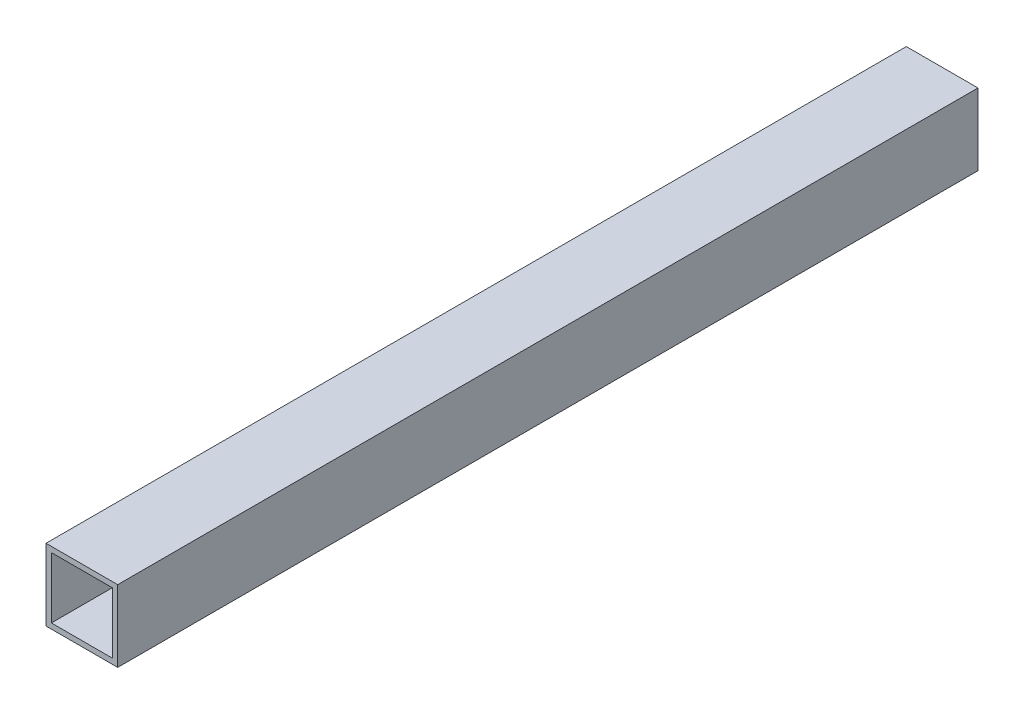
ISO-10303-21;
HEADER;
FILE_DESCRIPTION(('STEP AP214'),'2;1');
FILE_NAME('part.step','',(''),(''),'','','');
FILE_SCHEMA(('AUTOMOTIVE_DESIGN { 1 0 10303 214 1 1 1 1 }'));
ENDSEC;
DATA;
#1=APPLICATION_CONTEXT('core data for automotive mechanical design processes');
#2=APPLICATION_PROTOCOL_DEFINITION('international standard','automotive_design',2000,#1);
#3=PRODUCT_CONTEXT('',#1,'mechanical');
#4=PRODUCT('Part','Part','',(#3));
#5=PRODUCT_RELATED_PRODUCT_CATEGORY('part','',(#4));
#6=PRODUCT_DEFINITION_FORMATION('','',#4);
#7=PRODUCT_DEFINITION_CONTEXT('part definition',#1,'design');
#8=PRODUCT_DEFINITION('design','',#6,#7);
#9=PRODUCT_DEFINITION_SHAPE('','',#8);
#10=(LENGTH_UNIT() NAMED_UNIT(*) SI_UNIT(.MILLI.,.METRE.));
#11=(NAMED_UNIT(*) PLANE_ANGLE_UNIT() SI_UNIT($,.RADIAN.));
#12=(NAMED_UNIT(*) SI_UNIT($,.STERADIAN.) SOLID_ANGLE_UNIT());
#13=UNCERTAINTY_MEASURE_WITH_UNIT(LENGTH_MEASURE(1.E-05),#10,'distance_accuracy_value','');
#14=(GEOMETRIC_REPRESENTATION_CONTEXT(3) GLOBAL_UNCERTAINTY_ASSIGNED_CONTEXT((#13)) GLOBAL_UNIT_ASSIGNED_CONTEXT((#10,
#11,#12)) REPRESENTATION_CONTEXT('',''));
#15=CARTESIAN_POINT('',(0.,0.,0.));
#16=DIRECTION('',(0.,0.,1.));
#17=DIRECTION('',(1.,0.,0.));
#18=AXIS2_PLACEMENT_3D('',#15,#16,#17);
#19=CARTESIAN_POINT('',(0.,0.,240.));
#20=DIRECTION('',(0.,0.,1.));
#21=DIRECTION('',(1.,0.,0.));
#22=AXIS2_PLACEMENT_3D('',#19,#20,#21);
#23=PLANE('',#22);
#24=DIRECTION('',(0.,-1.,0.));
#25=VECTOR('',#24,1.);
#26=CARTESIAN_POINT('',(-10.,-10.,240.));
#27=LINE('',#26,#25);
#28=CARTESIAN_POINT('',(-10.,10.,240.));
#29=VERTEX_POINT('',#28);
#30=CARTESIAN_POINT('',(-10.,-10.,240.));
#31=VERTEX_POINT('',#30);
#32=EDGE_CURVE('E134',#29,#31,#27,.T.);
#33=ORIENTED_EDGE('',*,*,#32,.T.);
#34=DIRECTION('',(1.,0.,0.));
#35=VECTOR('',#34,1.);
#36=CARTESIAN_POINT('',(10.,-10.,240.));
#37=LINE('',#36,#35);
#38=CARTESIAN_POINT('',(10.,-10.,240.));
#39=VERTEX_POINT('',#38);
#40=EDGE_CURVE('E137',#31,#39,#37,.T.);
#41=ORIENTED_EDGE('',*,*,#40,.T.);
#42=DIRECTION('',(0.,1.,0.));
#43=VECTOR('',#42,1.);
#44=CARTESIAN_POINT('',(10.,-10.,240.));
#45=LINE('',#44,#43);
#46=CARTESIAN_POINT('',(10.,10.,240.));
#47=VERTEX_POINT('',#46);
#48=EDGE_CURVE('E140',#39,#47,#45,.T.);
#49=ORIENTED_EDGE('',*,*,#48,.T.);
#50=DIRECTION('',(-1.,0.,0.));
#51=VECTOR('',#50,1.);
#52=CARTESIAN_POINT('',(10.,10.,240.));
#53=LINE('',#52,#51);
#54=EDGE_CURVE('E142',#47,#29,#53,.T.);
#55=ORIENTED_EDGE('',*,*,#54,.T.);
#56=EDGE_LOOP('',(#33,#41,#49,#55));
#57=FACE_BOUND('',#56,.T.);
#58=DIRECTION('',(-1.,0.,0.));
#59=VECTOR('',#58,1.);
#60=CARTESIAN_POINT('',(8.5,8.5,240.));
#61=LINE('',#60,#59);
#62=CARTESIAN_POINT('',(8.5,8.5,240.));
#63=VERTEX_POINT('',#62);
#64=CARTESIAN_POINT('',(-8.5,8.49999999999999,240.));
#65=VERTEX_POINT('',#64);
#66=EDGE_CURVE('E106',#63,#65,#61,.T.);
#67=ORIENTED_EDGE('',*,*,#66,.F.);
#68=DIRECTION('',(0.,1.,0.));
#69=VECTOR('',#68,1.);
#70=CARTESIAN_POINT('',(8.5,-8.5,240.));
#71=LINE('',#70,#69);
#72=CARTESIAN_POINT('',(8.5,-8.5,240.));
#73=VERTEX_POINT('',#72);
#74=EDGE_CURVE('E98',#73,#63,#71,.T.);
#75=ORIENTED_EDGE('',*,*,#74,.F.);
#76=DIRECTION('',(1.,0.,0.));
#77=VECTOR('',#76,1.);
#78=CARTESIAN_POINT('',(8.5,-8.5,240.));
#79=LINE('',#78,#77);
#80=CARTESIAN_POINT('',(-8.5,-8.5,240.));
#81=VERTEX_POINT('',#80);
#82=EDGE_CURVE('E120',#81,#73,#79,.T.);
#83=ORIENTED_EDGE('',*,*,#82,.F.);
#84=DIRECTION('',(0.,-1.,0.));
#85=VECTOR('',#84,1.);
#86=CARTESIAN_POINT('',(-8.5,-8.5,240.));
#87=LINE('',#86,#85);
#88=EDGE_CURVE('E118',#65,#81,#87,.T.);
#89=ORIENTED_EDGE('',*,*,#88,.F.);
#90=EDGE_LOOP('',(#67,#75,#83,#89));
#91=FACE_BOUND('',#90,.T.);
#92=ADVANCED_FACE('F33',(#57,#91),#23,.T.);
#93=CARTESIAN_POINT('',(0.,0.,0.));
#94=DIRECTION('',(0.,0.,1.));
#95=DIRECTION('',(1.,0.,0.));
#96=AXIS2_PLACEMENT_3D('',#93,#94,#95);
#97=PLANE('',#96);
#98=DIRECTION('',(0.,-1.,0.));
#99=VECTOR('',#98,1.);
#100=CARTESIAN_POINT('',(-10.,-10.,0.));
#101=LINE('',#100,#99);
#102=CARTESIAN_POINT('',(-10.,10.,0.));
#103=VERTEX_POINT('',#102);
#104=CARTESIAN_POINT('',(-10.,-10.,0.));
#105=VERTEX_POINT('',#104);
#106=EDGE_CURVE('E114',#103,#105,#101,.T.);
#107=ORIENTED_EDGE('',*,*,#106,.F.);
#108=DIRECTION('',(-1.,0.,0.));
#109=VECTOR('',#108,1.);
#110=CARTESIAN_POINT('',(10.,10.,0.));
#111=LINE('',#110,#109);
#112=CARTESIAN_POINT('',(10.,10.,0.));
#113=VERTEX_POINT('',#112);
#114=EDGE_CURVE('E138',#113,#103,#111,.T.);
#115=ORIENTED_EDGE('',*,*,#114,.F.);
#116=DIRECTION('',(0.,1.,0.));
#117=VECTOR('',#116,1.);
#118=CARTESIAN_POINT('',(10.,-10.,0.));
#119=LINE('',#118,#117);
#120=CARTESIAN_POINT('',(10.,-10.,0.));
#121=VERTEX_POINT('',#120);
#122=EDGE_CURVE('E149',#121,#113,#119,.T.);
#123=ORIENTED_EDGE('',*,*,#122,.F.);
#124=DIRECTION('',(1.,0.,0.));
#125=VECTOR('',#124,1.);
#126=CARTESIAN_POINT('',(10.,-10.,0.));
#127=LINE('',#126,#125);
#128=EDGE_CURVE('E147',#105,#121,#127,.T.);
#129=ORIENTED_EDGE('',*,*,#128,.F.);
#130=EDGE_LOOP('',(#107,#115,#123,#129));
#131=FACE_BOUND('',#130,.T.);
#132=DIRECTION('',(0.,1.,0.));
#133=VECTOR('',#132,1.);
#134=CARTESIAN_POINT('',(8.5,-8.5,0.));
#135=LINE('',#134,#133);
#136=CARTESIAN_POINT('',(8.5,-8.5,0.));
#137=VERTEX_POINT('',#136);
#138=CARTESIAN_POINT('',(8.5,8.5,0.));
#139=VERTEX_POINT('',#138);
#140=EDGE_CURVE('E56',#137,#139,#135,.T.);
#141=ORIENTED_EDGE('',*,*,#140,.T.);
#142=DIRECTION('',(-1.,0.,0.));
#143=VECTOR('',#142,1.);
#144=CARTESIAN_POINT('',(8.5,8.5,0.));
#145=LINE('',#144,#143);
#146=CARTESIAN_POINT('',(-8.5,8.49999999999999,0.));
#147=VERTEX_POINT('',#146);
#148=EDGE_CURVE('E113',#139,#147,#145,.T.);
#149=ORIENTED_EDGE('',*,*,#148,.T.);
#150=DIRECTION('',(0.,-1.,0.));
#151=VECTOR('',#150,1.);
#152=CARTESIAN_POINT('',(-8.5,-8.5,0.));
#153=LINE('',#152,#151);
#154=CARTESIAN_POINT('',(-8.5,-8.5,0.));
#155=VERTEX_POINT('',#154);
#156=EDGE_CURVE('E126',#147,#155,#153,.T.);
#157=ORIENTED_EDGE('',*,*,#156,.T.);
#158=DIRECTION('',(1.,0.,0.));
#159=VECTOR('',#158,1.);
#160=CARTESIAN_POINT('',(8.5,-8.5,0.));
#161=LINE('',#160,#159);
#162=EDGE_CURVE('E107',#155,#137,#161,.T.);
#163=ORIENTED_EDGE('',*,*,#162,.T.);
#164=EDGE_LOOP('',(#141,#149,#157,#163));
#165=FACE_BOUND('',#164,.T.);
#166=ADVANCED_FACE('F167',(#131,#165),#97,.F.);
#167=CARTESIAN_POINT('',(-10.,-10.,240.));
#168=DIRECTION('',(1.,0.,0.));
#169=DIRECTION('',(0.,0.,-1.));
#170=AXIS2_PLACEMENT_3D('',#167,#168,#169);
#171=PLANE('',#170);
#172=ORIENTED_EDGE('',*,*,#106,.T.);
#173=DIRECTION('',(0.,0.,-1.));
#174=VECTOR('',#173,1.);
#175=CARTESIAN_POINT('',(-10.,-10.,240.));
#176=LINE('',#175,#174);
#177=EDGE_CURVE('E11',#31,#105,#176,.T.);
#178=ORIENTED_EDGE('',*,*,#177,.F.);
#179=ORIENTED_EDGE('',*,*,#32,.F.);
#180=DIRECTION('',(0.,0.,-1.));
#181=VECTOR('',#180,1.);
#182=CARTESIAN_POINT('',(-10.,10.,240.));
#183=LINE('',#182,#181);
#184=EDGE_CURVE('E144',#29,#103,#183,.T.);
#185=ORIENTED_EDGE('',*,*,#184,.T.);
#186=EDGE_LOOP('',(#172,#178,#179,#185));
#187=FACE_BOUND('',#186,.T.);
#188=ADVANCED_FACE('F35',(#187),#171,.F.);
#189=CARTESIAN_POINT('',(10.,-10.,240.));
#190=DIRECTION('',(0.,1.,0.));
#191=DIRECTION('',(-1.,0.,0.));
#192=AXIS2_PLACEMENT_3D('',#189,#190,#191);
#193=PLANE('',#192);
#194=ORIENTED_EDGE('',*,*,#128,.T.);
#195=DIRECTION('',(0.,0.,-1.));
#196=VECTOR('',#195,1.);
#197=CARTESIAN_POINT('',(10.,-10.,240.));
#198=LINE('',#197,#196);
#199=EDGE_CURVE('E41',#39,#121,#198,.T.);
#200=ORIENTED_EDGE('',*,*,#199,.F.);
#201=ORIENTED_EDGE('',*,*,#40,.F.);
#202=ORIENTED_EDGE('',*,*,#177,.T.);
#203=EDGE_LOOP('',(#194,#200,#201,#202));
#204=FACE_BOUND('',#203,.T.);
#205=ADVANCED_FACE('F177',(#204),#193,.F.);
#206=CARTESIAN_POINT('',(10.,-10.,240.));
#207=DIRECTION('',(-1.,0.,0.));
#208=DIRECTION('',(0.,0.,1.));
#209=AXIS2_PLACEMENT_3D('',#206,#207,#208);
#210=PLANE('',#209);
#211=ORIENTED_EDGE('',*,*,#122,.T.);
#212=DIRECTION('',(0.,0.,-1.));
#213=VECTOR('',#212,1.);
#214=CARTESIAN_POINT('',(10.,10.,240.));
#215=LINE('',#214,#213);
#216=EDGE_CURVE('E154',#47,#113,#215,.T.);
#217=ORIENTED_EDGE('',*,*,#216,.F.);
#218=ORIENTED_EDGE('',*,*,#48,.F.);
#219=ORIENTED_EDGE('',*,*,#199,.T.);
#220=EDGE_LOOP('',(#211,#217,#218,#219));
#221=FACE_BOUND('',#220,.T.);
#222=ADVANCED_FACE('F161',(#221),#210,.F.);
#223=CARTESIAN_POINT('',(10.,10.,240.));
#224=DIRECTION('',(0.,-1.,0.));
#225=DIRECTION('',(1.,0.,0.));
#226=AXIS2_PLACEMENT_3D('',#223,#224,#225);
#227=PLANE('',#226);
#228=ORIENTED_EDGE('',*,*,#114,.T.);
#229=ORIENTED_EDGE('',*,*,#184,.F.);
#230=ORIENTED_EDGE('',*,*,#54,.F.);
#231=ORIENTED_EDGE('',*,*,#216,.T.);
#232=EDGE_LOOP('',(#228,#229,#230,#231));
#233=FACE_BOUND('',#232,.T.);
#234=ADVANCED_FACE('F171',(#233),#227,.F.);
#235=CARTESIAN_POINT('',(8.5,-8.5,240.));
#236=DIRECTION('',(-1.,0.,0.));
#237=DIRECTION('',(0.,0.,1.));
#238=AXIS2_PLACEMENT_3D('',#235,#236,#237);
#239=PLANE('',#238);
#240=ORIENTED_EDGE('',*,*,#140,.F.);
#241=DIRECTION('',(0.,0.,-1.));
#242=VECTOR('',#241,1.);
#243=CARTESIAN_POINT('',(8.5,-8.5,240.));
#244=LINE('',#243,#242);
#245=EDGE_CURVE('E102',#73,#137,#244,.T.);
#246=ORIENTED_EDGE('',*,*,#245,.F.);
#247=ORIENTED_EDGE('',*,*,#74,.T.);
#248=DIRECTION('',(0.,0.,-1.));
#249=VECTOR('',#248,1.);
#250=CARTESIAN_POINT('',(8.5,8.5,240.));
#251=LINE('',#250,#249);
#252=EDGE_CURVE('E101',#63,#139,#251,.T.);
#253=ORIENTED_EDGE('',*,*,#252,.T.);
#254=EDGE_LOOP('',(#240,#246,#247,#253));
#255=FACE_BOUND('',#254,.T.);
#256=ADVANCED_FACE('F100',(#255),#239,.T.);
#257=CARTESIAN_POINT('',(8.5,8.5,240.));
#258=DIRECTION('',(0.,-1.,0.));
#259=DIRECTION('',(1.,0.,0.));
#260=AXIS2_PLACEMENT_3D('',#257,#258,#259);
#261=PLANE('',#260);
#262=ORIENTED_EDGE('',*,*,#148,.F.);
#263=ORIENTED_EDGE('',*,*,#252,.F.);
#264=ORIENTED_EDGE('',*,*,#66,.T.);
#265=DIRECTION('',(0.,0.,-1.));
#266=VECTOR('',#265,1.);
#267=CARTESIAN_POINT('',(-8.5,8.49999999999999,240.));
#268=LINE('',#267,#266);
#269=EDGE_CURVE('E115',#65,#147,#268,.T.);
#270=ORIENTED_EDGE('',*,*,#269,.T.);
#271=EDGE_LOOP('',(#262,#263,#264,#270));
#272=FACE_BOUND('',#271,.T.);
#273=ADVANCED_FACE('F110',(#272),#261,.T.);
#274=CARTESIAN_POINT('',(-8.5,-8.5,240.));
#275=DIRECTION('',(1.,0.,0.));
#276=DIRECTION('',(0.,1.,0.));
#277=AXIS2_PLACEMENT_3D('',#274,#275,#276);
#278=PLANE('',#277);
#279=ORIENTED_EDGE('',*,*,#156,.F.);
#280=ORIENTED_EDGE('',*,*,#269,.F.);
#281=ORIENTED_EDGE('',*,*,#88,.T.);
#282=DIRECTION('',(0.,0.,-1.));
#283=VECTOR('',#282,1.);
#284=CARTESIAN_POINT('',(-8.5,-8.5,240.));
#285=LINE('',#284,#283);
#286=EDGE_CURVE('E48',#81,#155,#285,.T.);
#287=ORIENTED_EDGE('',*,*,#286,.T.);
#288=EDGE_LOOP('',(#279,#280,#281,#287));
#289=FACE_BOUND('',#288,.T.);
#290=ADVANCED_FACE('F200',(#289),#278,.T.);
#291=CARTESIAN_POINT('',(8.5,-8.5,240.));
#292=DIRECTION('',(0.,1.,0.));
#293=DIRECTION('',(-1.,0.,0.));
#294=AXIS2_PLACEMENT_3D('',#291,#292,#293);
#295=PLANE('',#294);
#296=ORIENTED_EDGE('',*,*,#162,.F.);
#297=ORIENTED_EDGE('',*,*,#286,.F.);
#298=ORIENTED_EDGE('',*,*,#82,.T.);
#299=ORIENTED_EDGE('',*,*,#245,.T.);
#300=EDGE_LOOP('',(#296,#297,#298,#299));
#301=FACE_BOUND('',#300,.T.);
#302=ADVANCED_FACE('F204',(#301),#295,.T.);
#303=CLOSED_SHELL('',(#92,#166,#188,#205,#222,#234,#256,#273,#290,#302));
#304=MANIFOLD_SOLID_BREP('B2',#303);
#305=ADVANCED_BREP_SHAPE_REPRESENTATION('',(#18,#304),#14);
#306=SHAPE_DEFINITION_REPRESENTATION(#9,#305);
ENDSEC;
END-ISO-10303-21;
